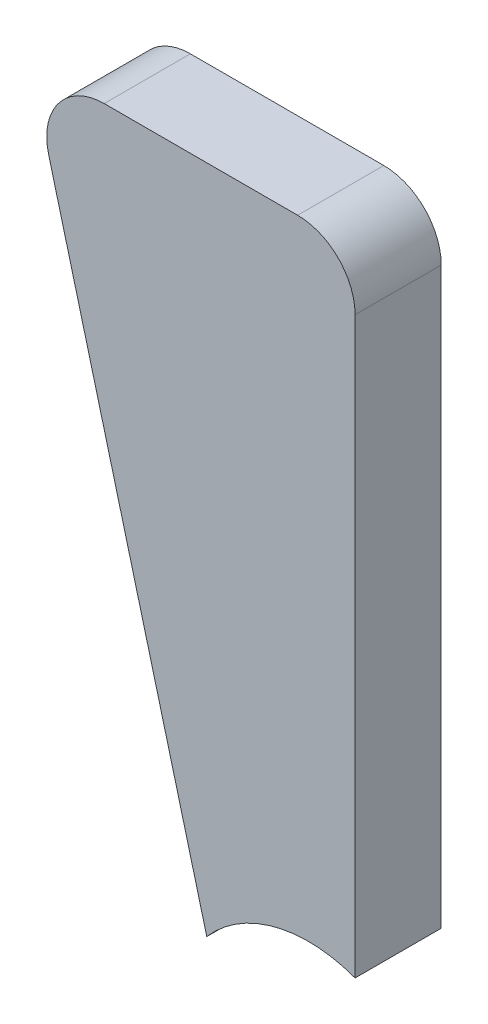
ISO-10303-21;
HEADER;
FILE_DESCRIPTION(('STEP AP214'),'2;1');
FILE_NAME('part.step','',(''),(''),'','','');
FILE_SCHEMA(('AUTOMOTIVE_DESIGN { 1 0 10303 214 1 1 1 1 }'));
ENDSEC;
DATA;
#1=APPLICATION_CONTEXT('core data for automotive mechanical design processes');
#2=APPLICATION_PROTOCOL_DEFINITION('international standard','automotive_design',2000,#1);
#3=PRODUCT_CONTEXT('',#1,'mechanical');
#4=PRODUCT('Part','Part','',(#3));
#5=PRODUCT_RELATED_PRODUCT_CATEGORY('part','',(#4));
#6=PRODUCT_DEFINITION_FORMATION('','',#4);
#7=PRODUCT_DEFINITION_CONTEXT('part definition',#1,'design');
#8=PRODUCT_DEFINITION('design','',#6,#7);
#9=PRODUCT_DEFINITION_SHAPE('','',#8);
#10=(LENGTH_UNIT() NAMED_UNIT(*) SI_UNIT(.MILLI.,.METRE.));
#11=(NAMED_UNIT(*) PLANE_ANGLE_UNIT() SI_UNIT($,.RADIAN.));
#12=(NAMED_UNIT(*) SI_UNIT($,.STERADIAN.) SOLID_ANGLE_UNIT());
#13=UNCERTAINTY_MEASURE_WITH_UNIT(LENGTH_MEASURE(1.E-05),#10,'distance_accuracy_value','');
#14=(GEOMETRIC_REPRESENTATION_CONTEXT(3) GLOBAL_UNCERTAINTY_ASSIGNED_CONTEXT((#13)) GLOBAL_UNIT_ASSIGNED_CONTEXT((#10,
#11,#12)) REPRESENTATION_CONTEXT('',''));
#15=CARTESIAN_POINT('',(0.,0.,0.));
#16=DIRECTION('',(0.,0.,1.));
#17=DIRECTION('',(1.,0.,0.));
#18=AXIS2_PLACEMENT_3D('',#15,#16,#17);
#19=CARTESIAN_POINT('',(-2.4368426845729,-6.56214886532175,4.5));
#20=DIRECTION('',(0.,0.,-1.));
#21=DIRECTION('',(-1.,0.,0.));
#22=AXIS2_PLACEMENT_3D('',#19,#20,#21);
#23=CYLINDRICAL_SURFACE('',#22,7.);
#24=CARTESIAN_POINT('',(-2.4368426845729,-6.56214886532175,0.));
#25=DIRECTION('',(0.,0.,-1.));
#26=DIRECTION('',(-1.,0.,0.));
#27=AXIS2_PLACEMENT_3D('',#24,#25,#26);
#28=CIRCLE('',#27,7.);
#29=CARTESIAN_POINT('',(-7.74596669241483,-2.00000000000001,0.));
#30=VERTEX_POINT('',#29);
#31=CARTESIAN_POINT('',(0.,0.,0.));
#32=VERTEX_POINT('',#31);
#33=EDGE_CURVE('E103',#30,#32,#28,.T.);
#34=ORIENTED_EDGE('',*,*,#33,.T.);
#35=DIRECTION('',(0.,0.,-1.));
#36=VECTOR('',#35,1.);
#37=CARTESIAN_POINT('',(0.,0.,4.5));
#38=LINE('',#37,#36);
#39=CARTESIAN_POINT('',(0.,0.,4.5));
#40=VERTEX_POINT('',#39);
#41=EDGE_CURVE('E86',#40,#32,#38,.T.);
#42=ORIENTED_EDGE('',*,*,#41,.F.);
#43=CARTESIAN_POINT('',(-2.4368426845729,-6.56214886532175,4.5));
#44=DIRECTION('',(0.,0.,-1.));
#45=DIRECTION('',(-1.,0.,0.));
#46=AXIS2_PLACEMENT_3D('',#43,#44,#45);
#47=CIRCLE('',#46,7.);
#48=CARTESIAN_POINT('',(-7.74596669241483,-2.00000000000001,4.5));
#49=VERTEX_POINT('',#48);
#50=EDGE_CURVE('E91',#49,#40,#47,.T.);
#51=ORIENTED_EDGE('',*,*,#50,.F.);
#52=DIRECTION('',(0.,0.,-1.));
#53=VECTOR('',#52,1.);
#54=CARTESIAN_POINT('',(-7.74596669241483,-2.00000000000001,4.5));
#55=LINE('',#54,#53);
#56=EDGE_CURVE('E105',#49,#30,#55,.T.);
#57=ORIENTED_EDGE('',*,*,#56,.T.);
#58=EDGE_LOOP('',(#34,#42,#51,#57));
#59=FACE_BOUND('',#58,.T.);
#60=ADVANCED_FACE('F33',(#59),#23,.F.);
#61=CARTESIAN_POINT('',(0.,0.,4.5));
#62=DIRECTION('',(-1.,0.,0.));
#63=DIRECTION('',(0.,0.,1.));
#64=AXIS2_PLACEMENT_3D('',#61,#62,#63);
#65=PLANE('',#64);
#66=DIRECTION('',(0.,1.,0.));
#67=VECTOR('',#66,1.);
#68=CARTESIAN_POINT('',(0.,0.,0.));
#69=LINE('',#68,#67);
#70=CARTESIAN_POINT('',(0.,30.,0.));
#71=VERTEX_POINT('',#70);
#72=EDGE_CURVE('E132',#32,#71,#69,.T.);
#73=ORIENTED_EDGE('',*,*,#72,.T.);
#74=DIRECTION('',(0.,0.,-1.));
#75=VECTOR('',#74,1.);
#76=CARTESIAN_POINT('',(0.,30.,4.5));
#77=LINE('',#76,#75);
#78=CARTESIAN_POINT('',(0.,30.,4.5));
#79=VERTEX_POINT('',#78);
#80=EDGE_CURVE('E41',#71,#79,#77,.F.);
#81=ORIENTED_EDGE('',*,*,#80,.T.);
#82=DIRECTION('',(0.,1.,0.));
#83=VECTOR('',#82,1.);
#84=CARTESIAN_POINT('',(0.,0.,4.5));
#85=LINE('',#84,#83);
#86=EDGE_CURVE('E82',#40,#79,#85,.T.);
#87=ORIENTED_EDGE('',*,*,#86,.F.);
#88=ORIENTED_EDGE('',*,*,#41,.T.);
#89=EDGE_LOOP('',(#73,#81,#87,#88));
#90=FACE_BOUND('',#89,.T.);
#91=ADVANCED_FACE('F84',(#90),#65,.F.);
#92=CARTESIAN_POINT('',(0.,33.,4.5));
#93=DIRECTION('',(0.,-1.,0.));
#94=DIRECTION('',(1.,0.,0.));
#95=AXIS2_PLACEMENT_3D('',#92,#93,#94);
#96=PLANE('',#95);
#97=DIRECTION('',(-1.,0.,0.));
#98=VECTOR('',#97,1.);
#99=CARTESIAN_POINT('',(0.,33.,4.5));
#100=LINE('',#99,#98);
#101=CARTESIAN_POINT('',(-3.,33.,4.5));
#102=VERTEX_POINT('',#101);
#103=CARTESIAN_POINT('',(-13.1037066260689,33.,4.5));
#104=VERTEX_POINT('',#103);
#105=EDGE_CURVE('E90',#102,#104,#100,.T.);
#106=ORIENTED_EDGE('',*,*,#105,.F.);
#107=DIRECTION('',(0.,0.,-1.));
#108=VECTOR('',#107,1.);
#109=CARTESIAN_POINT('',(-3.,33.,4.5));
#110=LINE('',#109,#108);
#111=CARTESIAN_POINT('',(-3.,33.,0.));
#112=VERTEX_POINT('',#111);
#113=EDGE_CURVE('E120',#102,#112,#110,.T.);
#114=ORIENTED_EDGE('',*,*,#113,.T.);
#115=DIRECTION('',(-1.,0.,0.));
#116=VECTOR('',#115,1.);
#117=CARTESIAN_POINT('',(0.,33.,0.));
#118=LINE('',#117,#116);
#119=CARTESIAN_POINT('',(-13.1037066260689,33.,0.));
#120=VERTEX_POINT('',#119);
#121=EDGE_CURVE('E127',#112,#120,#118,.T.);
#122=ORIENTED_EDGE('',*,*,#121,.T.);
#123=DIRECTION('',(0.,0.,-1.));
#124=VECTOR('',#123,1.);
#125=CARTESIAN_POINT('',(-13.1037066260689,33.,4.5));
#126=LINE('',#125,#124);
#127=EDGE_CURVE('E115',#120,#104,#126,.F.);
#128=ORIENTED_EDGE('',*,*,#127,.T.);
#129=EDGE_LOOP('',(#106,#114,#122,#128));
#130=FACE_BOUND('',#129,.T.);
#131=ADVANCED_FACE('F126',(#130),#96,.F.);
#132=CARTESIAN_POINT('',(-17.,33.,4.5));
#133=DIRECTION('',(0.966778114152899,0.255617053411866,0.));
#134=DIRECTION('',(-0.255617053411866,0.966778114152899,0.));
#135=AXIS2_PLACEMENT_3D('',#132,#133,#134);
#136=PLANE('',#135);
#137=DIRECTION('',(0.255617053411866,-0.966778114152899,0.));
#138=VECTOR('',#137,1.);
#139=CARTESIAN_POINT('',(-17.,33.,4.5));
#140=LINE('',#139,#138);
#141=CARTESIAN_POINT('',(-16.0040409685275,29.2331488397644,4.5));
#142=VERTEX_POINT('',#141);
#143=EDGE_CURVE('E96',#142,#49,#140,.T.);
#144=ORIENTED_EDGE('',*,*,#143,.F.);
#145=DIRECTION('',(0.,0.,-1.));
#146=VECTOR('',#145,1.);
#147=CARTESIAN_POINT('',(-16.0040409685275,29.2331488397644,4.5));
#148=LINE('',#147,#146);
#149=CARTESIAN_POINT('',(-16.0040409685275,29.2331488397644,0.));
#150=VERTEX_POINT('',#149);
#151=EDGE_CURVE('E104',#142,#150,#148,.T.);
#152=ORIENTED_EDGE('',*,*,#151,.T.);
#153=DIRECTION('',(0.255617053411866,-0.966778114152899,0.));
#154=VECTOR('',#153,1.);
#155=CARTESIAN_POINT('',(-17.,33.,0.));
#156=LINE('',#155,#154);
#157=EDGE_CURVE('E100',#150,#30,#156,.T.);
#158=ORIENTED_EDGE('',*,*,#157,.T.);
#159=ORIENTED_EDGE('',*,*,#56,.F.);
#160=EDGE_LOOP('',(#144,#152,#158,#159));
#161=FACE_BOUND('',#160,.T.);
#162=ADVANCED_FACE('F143',(#161),#136,.F.);
#163=CARTESIAN_POINT('',(-2.4368426845729,-6.56214886532175,4.5));
#164=DIRECTION('',(0.,0.,-1.));
#165=DIRECTION('',(-1.,0.,0.));
#166=AXIS2_PLACEMENT_3D('',#163,#164,#165);
#167=PLANE('',#166);
#168=ORIENTED_EDGE('',*,*,#86,.T.);
#169=CARTESIAN_POINT('',(-3.,30.,4.5));
#170=DIRECTION('',(0.,0.,-1.));
#171=DIRECTION('',(-1.,0.,0.));
#172=AXIS2_PLACEMENT_3D('',#169,#170,#171);
#173=CIRCLE('',#172,3.);
#174=EDGE_CURVE('E11',#79,#102,#173,.F.);
#175=ORIENTED_EDGE('',*,*,#174,.T.);
#176=ORIENTED_EDGE('',*,*,#105,.T.);
#177=CARTESIAN_POINT('',(-13.1037066260688,30.,4.5));
#178=DIRECTION('',(0.,0.,-1.));
#179=DIRECTION('',(-1.,0.,0.));
#180=AXIS2_PLACEMENT_3D('',#177,#178,#179);
#181=CIRCLE('',#180,3.);
#182=EDGE_CURVE('E118',#104,#142,#181,.F.);
#183=ORIENTED_EDGE('',*,*,#182,.T.);
#184=ORIENTED_EDGE('',*,*,#143,.T.);
#185=ORIENTED_EDGE('',*,*,#50,.T.);
#186=EDGE_LOOP('',(#168,#175,#176,#183,#184,#185));
#187=FACE_BOUND('',#186,.T.);
#188=ADVANCED_FACE('F94',(#187),#167,.F.);
#189=CARTESIAN_POINT('',(-2.4368426845729,-6.56214886532175,0.));
#190=DIRECTION('',(0.,0.,-1.));
#191=DIRECTION('',(-1.,0.,0.));
#192=AXIS2_PLACEMENT_3D('',#189,#190,#191);
#193=PLANE('',#192);
#194=ORIENTED_EDGE('',*,*,#121,.F.);
#195=CARTESIAN_POINT('',(-3.,30.,0.));
#196=DIRECTION('',(0.,0.,-1.));
#197=DIRECTION('',(-1.,0.,0.));
#198=AXIS2_PLACEMENT_3D('',#195,#196,#197);
#199=CIRCLE('',#198,3.);
#200=EDGE_CURVE('E55',#112,#71,#199,.T.);
#201=ORIENTED_EDGE('',*,*,#200,.T.);
#202=ORIENTED_EDGE('',*,*,#72,.F.);
#203=ORIENTED_EDGE('',*,*,#33,.F.);
#204=ORIENTED_EDGE('',*,*,#157,.F.);
#205=CARTESIAN_POINT('',(-13.1037066260688,30.,0.));
#206=DIRECTION('',(0.,0.,-1.));
#207=DIRECTION('',(-1.,0.,0.));
#208=AXIS2_PLACEMENT_3D('',#205,#206,#207);
#209=CIRCLE('',#208,3.);
#210=EDGE_CURVE('E108',#150,#120,#209,.T.);
#211=ORIENTED_EDGE('',*,*,#210,.T.);
#212=EDGE_LOOP('',(#194,#201,#202,#203,#204,#211));
#213=FACE_BOUND('',#212,.T.);
#214=ADVANCED_FACE('F129',(#213),#193,.T.);
#215=CARTESIAN_POINT('',(-13.1037066260688,30.,4.5));
#216=DIRECTION('',(0.,0.,-1.));
#217=DIRECTION('',(-1.,0.,0.));
#218=AXIS2_PLACEMENT_3D('',#215,#216,#217);
#219=CYLINDRICAL_SURFACE('',#218,3.);
#220=ORIENTED_EDGE('',*,*,#182,.F.);
#221=ORIENTED_EDGE('',*,*,#127,.F.);
#222=ORIENTED_EDGE('',*,*,#210,.F.);
#223=ORIENTED_EDGE('',*,*,#151,.F.);
#224=EDGE_LOOP('',(#220,#221,#222,#223));
#225=FACE_BOUND('',#224,.T.);
#226=ADVANCED_FACE('F141',(#225),#219,.T.);
#227=CARTESIAN_POINT('',(-3.,30.,4.5));
#228=DIRECTION('',(0.,0.,-1.));
#229=DIRECTION('',(-1.,0.,0.));
#230=AXIS2_PLACEMENT_3D('',#227,#228,#229);
#231=CYLINDRICAL_SURFACE('',#230,3.);
#232=ORIENTED_EDGE('',*,*,#174,.F.);
#233=ORIENTED_EDGE('',*,*,#80,.F.);
#234=ORIENTED_EDGE('',*,*,#200,.F.);
#235=ORIENTED_EDGE('',*,*,#113,.F.);
#236=EDGE_LOOP('',(#232,#233,#234,#235));
#237=FACE_BOUND('',#236,.T.);
#238=ADVANCED_FACE('F35',(#237),#231,.T.);
#239=CLOSED_SHELL('',(#60,#91,#131,#162,#188,#214,#226,#238));
#240=MANIFOLD_SOLID_BREP('B2',#239);
#241=ADVANCED_BREP_SHAPE_REPRESENTATION('',(#18,#240),#14);
#242=SHAPE_DEFINITION_REPRESENTATION(#9,#241);
ENDSEC;
END-ISO-10303-21;
